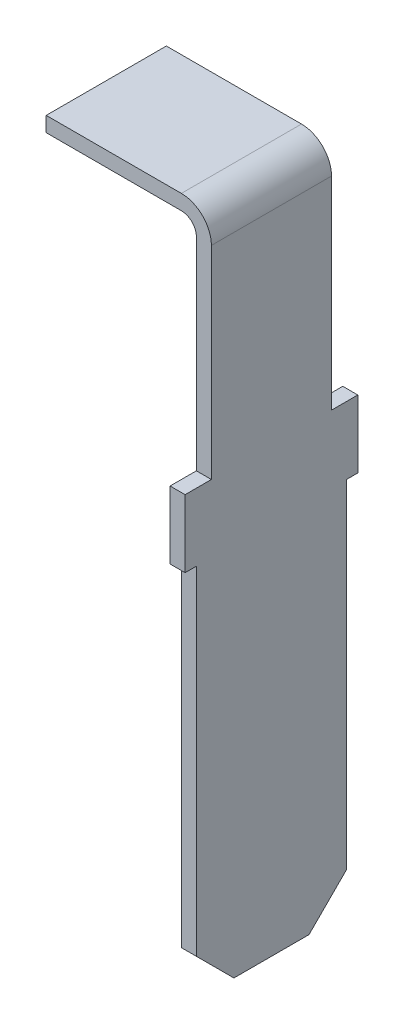
ISO-10303-21;
HEADER;
FILE_DESCRIPTION(('STEP AP214'),'2;1');
FILE_NAME('part.step','',(''),(''),'','','');
FILE_SCHEMA(('AUTOMOTIVE_DESIGN { 1 0 10303 214 1 1 1 1 }'));
ENDSEC;
DATA;
#1=APPLICATION_CONTEXT('core data for automotive mechanical design processes');
#2=APPLICATION_PROTOCOL_DEFINITION('international standard','automotive_design',2000,#1);
#3=PRODUCT_CONTEXT('',#1,'mechanical');
#4=PRODUCT('Part','Part','',(#3));
#5=PRODUCT_RELATED_PRODUCT_CATEGORY('part','',(#4));
#6=PRODUCT_DEFINITION_FORMATION('','',#4);
#7=PRODUCT_DEFINITION_CONTEXT('part definition',#1,'design');
#8=PRODUCT_DEFINITION('design','',#6,#7);
#9=PRODUCT_DEFINITION_SHAPE('','',#8);
#10=(LENGTH_UNIT() NAMED_UNIT(*) SI_UNIT(.MILLI.,.METRE.));
#11=(NAMED_UNIT(*) PLANE_ANGLE_UNIT() SI_UNIT($,.RADIAN.));
#12=(NAMED_UNIT(*) SI_UNIT($,.STERADIAN.) SOLID_ANGLE_UNIT());
#13=UNCERTAINTY_MEASURE_WITH_UNIT(LENGTH_MEASURE(1.E-05),#10,'distance_accuracy_value','');
#14=(GEOMETRIC_REPRESENTATION_CONTEXT(3) GLOBAL_UNCERTAINTY_ASSIGNED_CONTEXT((#13)) GLOBAL_UNIT_ASSIGNED_CONTEXT((#10,
#11,#12)) REPRESENTATION_CONTEXT('',''));
#15=CARTESIAN_POINT('',(0.,0.,0.));
#16=DIRECTION('',(0.,0.,1.));
#17=DIRECTION('',(1.,0.,0.));
#18=AXIS2_PLACEMENT_3D('',#15,#16,#17);
#19=CARTESIAN_POINT('',(67.94,-5.6,5.));
#20=DIRECTION('',(-1.,0.,0.));
#21=DIRECTION('',(0.,0.,1.));
#22=AXIS2_PLACEMENT_3D('',#19,#20,#21);
#23=PLANE('',#22);
#24=DIRECTION('',(0.,1.,0.));
#25=VECTOR('',#24,1.);
#26=CARTESIAN_POINT('',(67.94,-5.6,-0.8));
#27=LINE('',#26,#25);
#28=CARTESIAN_POINT('',(67.94,-5.5,-0.8));
#29=VERTEX_POINT('',#28);
#30=CARTESIAN_POINT('',(67.94,-5.7,-0.8));
#31=VERTEX_POINT('',#30);
#32=EDGE_CURVE('E68',#29,#31,#27,.F.);
#33=ORIENTED_EDGE('',*,*,#32,.T.);
#34=DIRECTION('',(0.,0.,-1.));
#35=VECTOR('',#34,1.);
#36=CARTESIAN_POINT('',(67.94,-5.7,5.));
#37=LINE('',#36,#35);
#38=CARTESIAN_POINT('',(67.94,-5.7,0.8));
#39=VERTEX_POINT('',#38);
#40=EDGE_CURVE('E227',#39,#31,#37,.T.);
#41=ORIENTED_EDGE('',*,*,#40,.F.);
#42=DIRECTION('',(0.,1.,0.));
#43=VECTOR('',#42,1.);
#44=CARTESIAN_POINT('',(67.94,-5.6,0.8));
#45=LINE('',#44,#43);
#46=CARTESIAN_POINT('',(67.94,-5.50000000003333,0.8));
#47=VERTEX_POINT('',#46);
#48=EDGE_CURVE('E292',#39,#47,#45,.T.);
#49=ORIENTED_EDGE('',*,*,#48,.T.);
#50=DIRECTION('',(0.,0.,1.));
#51=VECTOR('',#50,1.);
#52=CARTESIAN_POINT('',(67.94,-5.5,5.));
#53=LINE('',#52,#51);
#54=EDGE_CURVE('E230',#29,#47,#53,.T.);
#55=ORIENTED_EDGE('',*,*,#54,.F.);
#56=EDGE_LOOP('',(#33,#41,#49,#55));
#57=FACE_BOUND('',#56,.T.);
#58=ADVANCED_FACE('F16',(#57),#23,.T.);
#59=CARTESIAN_POINT('',(69.7399999999,-5.9000000001,5.));
#60=DIRECTION('',(0.,0.,-1.));
#61=DIRECTION('',(-1.,0.,0.));
#62=AXIS2_PLACEMENT_3D('',#59,#60,#61);
#63=CYLINDRICAL_SURFACE('',#62,0.199999999999998);
#64=DIRECTION('',(0.,0.,-1.));
#65=VECTOR('',#64,1.);
#66=CARTESIAN_POINT('',(69.74,-5.7,5.));
#67=LINE('',#66,#65);
#68=CARTESIAN_POINT('',(69.73999999995,-5.7,-0.8));
#69=VERTEX_POINT('',#68);
#70=CARTESIAN_POINT('',(69.73999999995,-5.7,0.8));
#71=VERTEX_POINT('',#70);
#72=EDGE_CURVE('E223',#69,#71,#67,.F.);
#73=ORIENTED_EDGE('',*,*,#72,.F.);
#74=CARTESIAN_POINT('',(69.7399999999,-5.9000000001,-0.8));
#75=DIRECTION('',(0.,0.,-1.));
#76=DIRECTION('',(-1.,0.,0.));
#77=AXIS2_PLACEMENT_3D('',#74,#75,#76);
#78=CIRCLE('',#77,0.199999999999998);
#79=CARTESIAN_POINT('',(69.94,-5.90000000005009,-0.8));
#80=VERTEX_POINT('',#79);
#81=EDGE_CURVE('E19',#80,#69,#78,.F.);
#82=ORIENTED_EDGE('',*,*,#81,.F.);
#83=DIRECTION('',(0.,0.,1.));
#84=VECTOR('',#83,1.);
#85=CARTESIAN_POINT('',(69.94,-5.90000000000017,5.));
#86=LINE('',#85,#84);
#87=CARTESIAN_POINT('',(69.93999999995,-5.90000000005009,0.8));
#88=VERTEX_POINT('',#87);
#89=EDGE_CURVE('E179',#88,#80,#86,.F.);
#90=ORIENTED_EDGE('',*,*,#89,.F.);
#91=CARTESIAN_POINT('',(69.7399999999,-5.9000000001,0.8));
#92=DIRECTION('',(0.,0.,-1.));
#93=DIRECTION('',(-1.,0.,0.));
#94=AXIS2_PLACEMENT_3D('',#91,#92,#93);
#95=CIRCLE('',#94,0.199999999999998);
#96=EDGE_CURVE('E235',#71,#88,#95,.T.);
#97=ORIENTED_EDGE('',*,*,#96,.F.);
#98=EDGE_LOOP('',(#73,#82,#90,#97));
#99=FACE_BOUND('',#98,.T.);
#100=ADVANCED_FACE('F313',(#99),#63,.F.);
#101=CARTESIAN_POINT('',(68.8399999999999,-5.5,5.));
#102=DIRECTION('',(0.,1.,0.));
#103=DIRECTION('',(0.,0.,1.));
#104=AXIS2_PLACEMENT_3D('',#101,#102,#103);
#105=PLANE('',#104);
#106=DIRECTION('',(-1.,0.,0.));
#107=VECTOR('',#106,1.);
#108=CARTESIAN_POINT('',(70.14,-5.5,-0.8));
#109=LINE('',#108,#107);
#110=CARTESIAN_POINT('',(69.7399999999499,-5.5,-0.8));
#111=VERTEX_POINT('',#110);
#112=EDGE_CURVE('E174',#29,#111,#109,.F.);
#113=ORIENTED_EDGE('',*,*,#112,.F.);
#114=ORIENTED_EDGE('',*,*,#54,.T.);
#115=DIRECTION('',(1.,0.,0.));
#116=VECTOR('',#115,1.);
#117=CARTESIAN_POINT('',(70.14,-5.5000000001,0.8));
#118=LINE('',#117,#116);
#119=CARTESIAN_POINT('',(69.7399999999499,-5.50000000005,0.8));
#120=VERTEX_POINT('',#119);
#121=EDGE_CURVE('E320',#120,#47,#118,.F.);
#122=ORIENTED_EDGE('',*,*,#121,.F.);
#123=DIRECTION('',(0.,0.,1.));
#124=VECTOR('',#123,1.);
#125=CARTESIAN_POINT('',(69.7399999999998,-5.5,5.));
#126=LINE('',#125,#124);
#127=EDGE_CURVE('E89',#120,#111,#126,.F.);
#128=ORIENTED_EDGE('',*,*,#127,.T.);
#129=EDGE_LOOP('',(#113,#114,#122,#128));
#130=FACE_BOUND('',#129,.T.);
#131=ADVANCED_FACE('F487',(#130),#105,.T.);
#132=CARTESIAN_POINT('',(68.84,-5.7,5.));
#133=DIRECTION('',(0.,-1.,0.));
#134=DIRECTION('',(0.,0.,-1.));
#135=AXIS2_PLACEMENT_3D('',#132,#133,#134);
#136=PLANE('',#135);
#137=DIRECTION('',(-1.,0.,0.));
#138=VECTOR('',#137,1.);
#139=CARTESIAN_POINT('',(70.14,-5.7,-0.8));
#140=LINE('',#139,#138);
#141=EDGE_CURVE('E181',#69,#31,#140,.T.);
#142=ORIENTED_EDGE('',*,*,#141,.F.);
#143=ORIENTED_EDGE('',*,*,#72,.T.);
#144=DIRECTION('',(1.,0.,0.));
#145=VECTOR('',#144,1.);
#146=CARTESIAN_POINT('',(70.14,-5.7,0.8));
#147=LINE('',#146,#145);
#148=EDGE_CURVE('E312',#39,#71,#147,.T.);
#149=ORIENTED_EDGE('',*,*,#148,.F.);
#150=ORIENTED_EDGE('',*,*,#40,.T.);
#151=EDGE_LOOP('',(#142,#143,#149,#150));
#152=FACE_BOUND('',#151,.T.);
#153=ADVANCED_FACE('F490',(#152),#136,.T.);
#154=CARTESIAN_POINT('',(69.94,-10.2000000000001,5.));
#155=DIRECTION('',(-1.,0.,0.));
#156=DIRECTION('',(0.,0.,1.));
#157=AXIS2_PLACEMENT_3D('',#154,#155,#156);
#158=PLANE('',#157);
#159=DIRECTION('',(0.,1.,0.));
#160=VECTOR('',#159,1.);
#161=CARTESIAN_POINT('',(69.94,-9.05,1.15));
#162=LINE('',#161,#160);
#163=CARTESIAN_POINT('',(69.94,-8.6,1.15));
#164=VERTEX_POINT('',#163);
#165=CARTESIAN_POINT('',(69.94,-9.5,1.15));
#166=VERTEX_POINT('',#165);
#167=EDGE_CURVE('E241',#164,#166,#162,.F.);
#168=ORIENTED_EDGE('',*,*,#167,.F.);
#169=DIRECTION('',(0.,0.,1.));
#170=VECTOR('',#169,1.);
#171=CARTESIAN_POINT('',(69.94,-8.6,0.975));
#172=LINE('',#171,#170);
#173=CARTESIAN_POINT('',(69.9399999999333,-8.6,0.8));
#174=VERTEX_POINT('',#173);
#175=EDGE_CURVE('E214',#174,#164,#172,.T.);
#176=ORIENTED_EDGE('',*,*,#175,.F.);
#177=DIRECTION('',(0.,1.,0.));
#178=VECTOR('',#177,1.);
#179=CARTESIAN_POINT('',(69.9399999999,-5.6,0.8));
#180=LINE('',#179,#178);
#181=EDGE_CURVE('E96',#88,#174,#180,.F.);
#182=ORIENTED_EDGE('',*,*,#181,.F.);
#183=ORIENTED_EDGE('',*,*,#89,.T.);
#184=DIRECTION('',(0.,1.,0.));
#185=VECTOR('',#184,1.);
#186=CARTESIAN_POINT('',(69.94,-5.6,-0.8));
#187=LINE('',#186,#185);
#188=CARTESIAN_POINT('',(69.94,-8.6,-0.8));
#189=VERTEX_POINT('',#188);
#190=EDGE_CURVE('E176',#189,#80,#187,.T.);
#191=ORIENTED_EDGE('',*,*,#190,.F.);
#192=DIRECTION('',(0.,0.,1.));
#193=VECTOR('',#192,1.);
#194=CARTESIAN_POINT('',(69.94,-8.6,-0.975));
#195=LINE('',#194,#193);
#196=CARTESIAN_POINT('',(69.94,-8.6,-1.15));
#197=VERTEX_POINT('',#196);
#198=EDGE_CURVE('E164',#197,#189,#195,.T.);
#199=ORIENTED_EDGE('',*,*,#198,.F.);
#200=DIRECTION('',(0.,1.,0.));
#201=VECTOR('',#200,1.);
#202=CARTESIAN_POINT('',(69.94,-9.05,-1.15));
#203=LINE('',#202,#201);
#204=CARTESIAN_POINT('',(69.94,-9.5,-1.15));
#205=VERTEX_POINT('',#204);
#206=EDGE_CURVE('E159',#205,#197,#203,.T.);
#207=ORIENTED_EDGE('',*,*,#206,.F.);
#208=DIRECTION('',(0.,0.,-1.));
#209=VECTOR('',#208,1.);
#210=CARTESIAN_POINT('',(69.94,-9.5,-1.075));
#211=LINE('',#210,#209);
#212=CARTESIAN_POINT('',(69.94,-9.5,-1.));
#213=VERTEX_POINT('',#212);
#214=EDGE_CURVE('E283',#213,#205,#211,.T.);
#215=ORIENTED_EDGE('',*,*,#214,.F.);
#216=DIRECTION('',(0.,1.,0.));
#217=VECTOR('',#216,1.);
#218=CARTESIAN_POINT('',(69.94,-11.75,-1.));
#219=LINE('',#218,#217);
#220=CARTESIAN_POINT('',(69.94,-14.,-1.));
#221=VERTEX_POINT('',#220);
#222=EDGE_CURVE('E277',#221,#213,#219,.T.);
#223=ORIENTED_EDGE('',*,*,#222,.F.);
#224=DIRECTION('',(0.,0.707106781186548,-0.707106781186548));
#225=VECTOR('',#224,1.);
#226=CARTESIAN_POINT('',(69.94,-14.25,-0.75));
#227=LINE('',#226,#225);
#228=CARTESIAN_POINT('',(69.94,-14.5,-0.5));
#229=VERTEX_POINT('',#228);
#230=EDGE_CURVE('E271',#229,#221,#227,.T.);
#231=ORIENTED_EDGE('',*,*,#230,.F.);
#232=DIRECTION('',(0.,0.,-1.));
#233=VECTOR('',#232,1.);
#234=CARTESIAN_POINT('',(69.94,-14.5,0.));
#235=LINE('',#234,#233);
#236=CARTESIAN_POINT('',(69.94,-14.5,0.5));
#237=VERTEX_POINT('',#236);
#238=EDGE_CURVE('E265',#237,#229,#235,.T.);
#239=ORIENTED_EDGE('',*,*,#238,.F.);
#240=DIRECTION('',(0.,-0.707106781186548,-0.707106781186548));
#241=VECTOR('',#240,1.);
#242=CARTESIAN_POINT('',(69.94,-14.25,0.75));
#243=LINE('',#242,#241);
#244=CARTESIAN_POINT('',(69.94,-14.,1.));
#245=VERTEX_POINT('',#244);
#246=EDGE_CURVE('E259',#245,#237,#243,.T.);
#247=ORIENTED_EDGE('',*,*,#246,.F.);
#248=DIRECTION('',(0.,1.,0.));
#249=VECTOR('',#248,1.);
#250=CARTESIAN_POINT('',(69.94,-11.75,1.));
#251=LINE('',#250,#249);
#252=CARTESIAN_POINT('',(69.94,-9.5,1.));
#253=VERTEX_POINT('',#252);
#254=EDGE_CURVE('E253',#253,#245,#251,.F.);
#255=ORIENTED_EDGE('',*,*,#254,.F.);
#256=DIRECTION('',(0.,0.,-1.));
#257=VECTOR('',#256,1.);
#258=CARTESIAN_POINT('',(69.94,-9.5,1.075));
#259=LINE('',#258,#257);
#260=EDGE_CURVE('E247',#166,#253,#259,.T.);
#261=ORIENTED_EDGE('',*,*,#260,.F.);
#262=EDGE_LOOP('',(#168,#176,#182,#183,#191,#199,#207,#215,#223,#231,#239,#247,#255,#261));
#263=FACE_BOUND('',#262,.T.);
#264=ADVANCED_FACE('F178',(#263),#158,.T.);
#265=CARTESIAN_POINT('',(70.14,-5.6,-0.8));
#266=DIRECTION('',(0.,0.,-1.));
#267=DIRECTION('',(-1.,0.,0.));
#268=AXIS2_PLACEMENT_3D('',#265,#266,#267);
#269=PLANE('',#268);
#270=ORIENTED_EDGE('',*,*,#32,.F.);
#271=ORIENTED_EDGE('',*,*,#112,.T.);
#272=CARTESIAN_POINT('',(69.7399999999,-5.9000000001,-0.8));
#273=DIRECTION('',(0.,0.,-1.));
#274=DIRECTION('',(-1.,0.,0.));
#275=AXIS2_PLACEMENT_3D('',#272,#273,#274);
#276=CIRCLE('',#275,0.400000000000002);
#277=CARTESIAN_POINT('',(70.14,-5.90000000005,-0.8));
#278=VERTEX_POINT('',#277);
#279=EDGE_CURVE('E201',#278,#111,#276,.F.);
#280=ORIENTED_EDGE('',*,*,#279,.F.);
#281=DIRECTION('',(0.,1.,0.));
#282=VECTOR('',#281,1.);
#283=CARTESIAN_POINT('',(70.14,-8.51803854646187,-0.8));
#284=LINE('',#283,#282);
#285=CARTESIAN_POINT('',(70.14,-8.6,-0.8));
#286=VERTEX_POINT('',#285);
#287=EDGE_CURVE('E186',#278,#286,#284,.F.);
#288=ORIENTED_EDGE('',*,*,#287,.T.);
#289=DIRECTION('',(1.,0.,0.));
#290=VECTOR('',#289,1.);
#291=CARTESIAN_POINT('',(70.14,-8.6,-0.8));
#292=LINE('',#291,#290);
#293=EDGE_CURVE('E169',#189,#286,#292,.T.);
#294=ORIENTED_EDGE('',*,*,#293,.F.);
#295=ORIENTED_EDGE('',*,*,#190,.T.);
#296=ORIENTED_EDGE('',*,*,#81,.T.);
#297=ORIENTED_EDGE('',*,*,#141,.T.);
#298=EDGE_LOOP('',(#270,#271,#280,#288,#294,#295,#296,#297));
#299=FACE_BOUND('',#298,.T.);
#300=ADVANCED_FACE('F184',(#299),#269,.T.);
#301=CARTESIAN_POINT('',(70.14,-8.6,-0.975));
#302=DIRECTION('',(0.,1.,0.));
#303=DIRECTION('',(0.,0.,1.));
#304=AXIS2_PLACEMENT_3D('',#301,#302,#303);
#305=PLANE('',#304);
#306=DIRECTION('',(0.,0.,1.));
#307=VECTOR('',#306,1.);
#308=CARTESIAN_POINT('',(70.14,-8.6,0.));
#309=LINE('',#308,#307);
#310=CARTESIAN_POINT('',(70.14,-8.6,-1.15));
#311=VERTEX_POINT('',#310);
#312=EDGE_CURVE('E200',#286,#311,#309,.F.);
#313=ORIENTED_EDGE('',*,*,#312,.T.);
#314=DIRECTION('',(-1.,0.,0.));
#315=VECTOR('',#314,1.);
#316=CARTESIAN_POINT('',(70.14,-8.6,-1.15));
#317=LINE('',#316,#315);
#318=EDGE_CURVE('E171',#197,#311,#317,.F.);
#319=ORIENTED_EDGE('',*,*,#318,.F.);
#320=ORIENTED_EDGE('',*,*,#198,.T.);
#321=ORIENTED_EDGE('',*,*,#293,.T.);
#322=EDGE_LOOP('',(#313,#319,#320,#321));
#323=FACE_BOUND('',#322,.T.);
#324=ADVANCED_FACE('F167',(#323),#305,.T.);
#325=CARTESIAN_POINT('',(70.14,-9.05,-1.15));
#326=DIRECTION('',(0.,0.,-1.));
#327=DIRECTION('',(-1.,0.,0.));
#328=AXIS2_PLACEMENT_3D('',#325,#326,#327);
#329=PLANE('',#328);
#330=DIRECTION('',(0.,1.,0.));
#331=VECTOR('',#330,1.);
#332=CARTESIAN_POINT('',(70.14,-8.51803854646187,-1.15));
#333=LINE('',#332,#331);
#334=CARTESIAN_POINT('',(70.14,-9.5,-1.15));
#335=VERTEX_POINT('',#334);
#336=EDGE_CURVE('E424',#311,#335,#333,.F.);
#337=ORIENTED_EDGE('',*,*,#336,.T.);
#338=DIRECTION('',(1.,0.,0.));
#339=VECTOR('',#338,1.);
#340=CARTESIAN_POINT('',(70.14,-9.5,-1.15));
#341=LINE('',#340,#339);
#342=EDGE_CURVE('E280',#205,#335,#341,.T.);
#343=ORIENTED_EDGE('',*,*,#342,.F.);
#344=ORIENTED_EDGE('',*,*,#206,.T.);
#345=ORIENTED_EDGE('',*,*,#318,.T.);
#346=EDGE_LOOP('',(#337,#343,#344,#345));
#347=FACE_BOUND('',#346,.T.);
#348=ADVANCED_FACE('F446',(#347),#329,.T.);
#349=CARTESIAN_POINT('',(70.14,-9.5,-1.075));
#350=DIRECTION('',(0.,-1.,0.));
#351=DIRECTION('',(0.,0.,-1.));
#352=AXIS2_PLACEMENT_3D('',#349,#350,#351);
#353=PLANE('',#352);
#354=DIRECTION('',(0.,0.,1.));
#355=VECTOR('',#354,1.);
#356=CARTESIAN_POINT('',(70.14,-9.5,0.));
#357=LINE('',#356,#355);
#358=CARTESIAN_POINT('',(70.14,-9.5,-1.));
#359=VERTEX_POINT('',#358);
#360=EDGE_CURVE('E414',#335,#359,#357,.T.);
#361=ORIENTED_EDGE('',*,*,#360,.T.);
#362=DIRECTION('',(-1.,0.,0.));
#363=VECTOR('',#362,1.);
#364=CARTESIAN_POINT('',(70.14,-9.5,-1.));
#365=LINE('',#364,#363);
#366=EDGE_CURVE('E274',#213,#359,#365,.F.);
#367=ORIENTED_EDGE('',*,*,#366,.F.);
#368=ORIENTED_EDGE('',*,*,#214,.T.);
#369=ORIENTED_EDGE('',*,*,#342,.T.);
#370=EDGE_LOOP('',(#361,#367,#368,#369));
#371=FACE_BOUND('',#370,.T.);
#372=ADVANCED_FACE('F448',(#371),#353,.T.);
#373=CARTESIAN_POINT('',(70.14,-11.75,-1.));
#374=DIRECTION('',(0.,0.,-1.));
#375=DIRECTION('',(-1.,0.,0.));
#376=AXIS2_PLACEMENT_3D('',#373,#374,#375);
#377=PLANE('',#376);
#378=DIRECTION('',(0.,1.,0.));
#379=VECTOR('',#378,1.);
#380=CARTESIAN_POINT('',(70.14,-8.51803854646187,-1.));
#381=LINE('',#380,#379);
#382=CARTESIAN_POINT('',(70.14,-14.,-1.));
#383=VERTEX_POINT('',#382);
#384=EDGE_CURVE('E404',#359,#383,#381,.F.);
#385=ORIENTED_EDGE('',*,*,#384,.T.);
#386=DIRECTION('',(1.,0.,0.));
#387=VECTOR('',#386,1.);
#388=CARTESIAN_POINT('',(70.14,-14.,-1.));
#389=LINE('',#388,#387);
#390=EDGE_CURVE('E268',#221,#383,#389,.T.);
#391=ORIENTED_EDGE('',*,*,#390,.F.);
#392=ORIENTED_EDGE('',*,*,#222,.T.);
#393=ORIENTED_EDGE('',*,*,#366,.T.);
#394=EDGE_LOOP('',(#385,#391,#392,#393));
#395=FACE_BOUND('',#394,.T.);
#396=ADVANCED_FACE('F457',(#395),#377,.T.);
#397=CARTESIAN_POINT('',(70.14,-14.25,-0.75));
#398=DIRECTION('',(0.,-0.707106781186548,-0.707106781186548));
#399=DIRECTION('',(0.,0.707106781186548,-0.707106781186548));
#400=AXIS2_PLACEMENT_3D('',#397,#398,#399);
#401=PLANE('',#400);
#402=DIRECTION('',(0.,-0.707106781186548,0.707106781186547));
#403=VECTOR('',#402,1.);
#404=CARTESIAN_POINT('',(70.14,-14.,-1.));
#405=LINE('',#404,#403);
#406=CARTESIAN_POINT('',(70.14,-14.5,-0.5));
#407=VERTEX_POINT('',#406);
#408=EDGE_CURVE('E394',#383,#407,#405,.T.);
#409=ORIENTED_EDGE('',*,*,#408,.T.);
#410=DIRECTION('',(1.,0.,0.));
#411=VECTOR('',#410,1.);
#412=CARTESIAN_POINT('',(70.14,-14.5,-0.5));
#413=LINE('',#412,#411);
#414=EDGE_CURVE('E262',#229,#407,#413,.T.);
#415=ORIENTED_EDGE('',*,*,#414,.F.);
#416=ORIENTED_EDGE('',*,*,#230,.T.);
#417=ORIENTED_EDGE('',*,*,#390,.T.);
#418=EDGE_LOOP('',(#409,#415,#416,#417));
#419=FACE_BOUND('',#418,.T.);
#420=ADVANCED_FACE('F460',(#419),#401,.T.);
#421=CARTESIAN_POINT('',(70.14,-14.5,0.));
#422=DIRECTION('',(0.,-1.,0.));
#423=DIRECTION('',(0.,0.,-1.));
#424=AXIS2_PLACEMENT_3D('',#421,#422,#423);
#425=PLANE('',#424);
#426=DIRECTION('',(0.,0.,1.));
#427=VECTOR('',#426,1.);
#428=CARTESIAN_POINT('',(70.14,-14.5,0.));
#429=LINE('',#428,#427);
#430=CARTESIAN_POINT('',(70.14,-14.5,0.5));
#431=VERTEX_POINT('',#430);
#432=EDGE_CURVE('E384',#407,#431,#429,.T.);
#433=ORIENTED_EDGE('',*,*,#432,.T.);
#434=DIRECTION('',(1.,0.,0.));
#435=VECTOR('',#434,1.);
#436=CARTESIAN_POINT('',(70.14,-14.5,0.5));
#437=LINE('',#436,#435);
#438=EDGE_CURVE('E256',#237,#431,#437,.T.);
#439=ORIENTED_EDGE('',*,*,#438,.F.);
#440=ORIENTED_EDGE('',*,*,#238,.T.);
#441=ORIENTED_EDGE('',*,*,#414,.T.);
#442=EDGE_LOOP('',(#433,#439,#440,#441));
#443=FACE_BOUND('',#442,.T.);
#444=ADVANCED_FACE('F466',(#443),#425,.T.);
#445=CARTESIAN_POINT('',(70.14,-14.25,0.75));
#446=DIRECTION('',(0.,-0.707106781186548,0.707106781186548));
#447=DIRECTION('',(0.,-0.707106781186548,-0.707106781186548));
#448=AXIS2_PLACEMENT_3D('',#445,#446,#447);
#449=PLANE('',#448);
#450=DIRECTION('',(0.,0.707106781186548,0.707106781186547));
#451=VECTOR('',#450,1.);
#452=CARTESIAN_POINT('',(70.14,-14.5,0.5));
#453=LINE('',#452,#451);
#454=CARTESIAN_POINT('',(70.14,-14.,1.));
#455=VERTEX_POINT('',#454);
#456=EDGE_CURVE('E374',#431,#455,#453,.T.);
#457=ORIENTED_EDGE('',*,*,#456,.T.);
#458=DIRECTION('',(1.,0.,0.));
#459=VECTOR('',#458,1.);
#460=CARTESIAN_POINT('',(70.14,-14.,1.));
#461=LINE('',#460,#459);
#462=EDGE_CURVE('E250',#245,#455,#461,.T.);
#463=ORIENTED_EDGE('',*,*,#462,.F.);
#464=ORIENTED_EDGE('',*,*,#246,.T.);
#465=ORIENTED_EDGE('',*,*,#438,.T.);
#466=EDGE_LOOP('',(#457,#463,#464,#465));
#467=FACE_BOUND('',#466,.T.);
#468=ADVANCED_FACE('F473',(#467),#449,.T.);
#469=CARTESIAN_POINT('',(70.14,-11.75,1.));
#470=DIRECTION('',(0.,0.,1.));
#471=DIRECTION('',(1.,0.,0.));
#472=AXIS2_PLACEMENT_3D('',#469,#470,#471);
#473=PLANE('',#472);
#474=DIRECTION('',(0.,1.,0.));
#475=VECTOR('',#474,1.);
#476=CARTESIAN_POINT('',(70.14,-8.51803854646187,1.));
#477=LINE('',#476,#475);
#478=CARTESIAN_POINT('',(70.14,-9.5,1.));
#479=VERTEX_POINT('',#478);
#480=EDGE_CURVE('E364',#455,#479,#477,.T.);
#481=ORIENTED_EDGE('',*,*,#480,.T.);
#482=DIRECTION('',(1.,0.,0.));
#483=VECTOR('',#482,1.);
#484=CARTESIAN_POINT('',(70.14,-9.5,1.));
#485=LINE('',#484,#483);
#486=EDGE_CURVE('E244',#253,#479,#485,.T.);
#487=ORIENTED_EDGE('',*,*,#486,.F.);
#488=ORIENTED_EDGE('',*,*,#254,.T.);
#489=ORIENTED_EDGE('',*,*,#462,.T.);
#490=EDGE_LOOP('',(#481,#487,#488,#489));
#491=FACE_BOUND('',#490,.T.);
#492=ADVANCED_FACE('F475',(#491),#473,.T.);
#493=CARTESIAN_POINT('',(70.14,-9.5,1.075));
#494=DIRECTION('',(0.,-1.,0.));
#495=DIRECTION('',(0.,0.,-1.));
#496=AXIS2_PLACEMENT_3D('',#493,#494,#495);
#497=PLANE('',#496);
#498=DIRECTION('',(0.,0.,1.));
#499=VECTOR('',#498,1.);
#500=CARTESIAN_POINT('',(70.14,-9.5,0.));
#501=LINE('',#500,#499);
#502=CARTESIAN_POINT('',(70.14,-9.5,1.15));
#503=VERTEX_POINT('',#502);
#504=EDGE_CURVE('E354',#479,#503,#501,.T.);
#505=ORIENTED_EDGE('',*,*,#504,.T.);
#506=DIRECTION('',(1.,0.,0.));
#507=VECTOR('',#506,1.);
#508=CARTESIAN_POINT('',(70.14,-9.5,1.15));
#509=LINE('',#508,#507);
#510=EDGE_CURVE('E218',#166,#503,#509,.T.);
#511=ORIENTED_EDGE('',*,*,#510,.F.);
#512=ORIENTED_EDGE('',*,*,#260,.T.);
#513=ORIENTED_EDGE('',*,*,#486,.T.);
#514=EDGE_LOOP('',(#505,#511,#512,#513));
#515=FACE_BOUND('',#514,.T.);
#516=ADVANCED_FACE('F481',(#515),#497,.T.);
#517=CARTESIAN_POINT('',(70.14,-9.05,1.15));
#518=DIRECTION('',(0.,0.,1.));
#519=DIRECTION('',(1.,0.,0.));
#520=AXIS2_PLACEMENT_3D('',#517,#518,#519);
#521=PLANE('',#520);
#522=DIRECTION('',(0.,1.,0.));
#523=VECTOR('',#522,1.);
#524=CARTESIAN_POINT('',(70.14,-8.51803854646187,1.15));
#525=LINE('',#524,#523);
#526=CARTESIAN_POINT('',(70.14,-8.6,1.15));
#527=VERTEX_POINT('',#526);
#528=EDGE_CURVE('E343',#503,#527,#525,.T.);
#529=ORIENTED_EDGE('',*,*,#528,.T.);
#530=DIRECTION('',(1.,0.,0.));
#531=VECTOR('',#530,1.);
#532=CARTESIAN_POINT('',(70.14,-8.6,1.15));
#533=LINE('',#532,#531);
#534=EDGE_CURVE('E217',#164,#527,#533,.T.);
#535=ORIENTED_EDGE('',*,*,#534,.F.);
#536=ORIENTED_EDGE('',*,*,#167,.T.);
#537=ORIENTED_EDGE('',*,*,#510,.T.);
#538=EDGE_LOOP('',(#529,#535,#536,#537));
#539=FACE_BOUND('',#538,.T.);
#540=ADVANCED_FACE('F484',(#539),#521,.T.);
#541=CARTESIAN_POINT('',(70.14,-8.6,0.975));
#542=DIRECTION('',(0.,1.,0.));
#543=DIRECTION('',(0.,0.,1.));
#544=AXIS2_PLACEMENT_3D('',#541,#542,#543);
#545=PLANE('',#544);
#546=DIRECTION('',(0.,0.,1.));
#547=VECTOR('',#546,1.);
#548=CARTESIAN_POINT('',(70.14,-8.6,0.));
#549=LINE('',#548,#547);
#550=CARTESIAN_POINT('',(70.14,-8.6,0.8));
#551=VERTEX_POINT('',#550);
#552=EDGE_CURVE('E335',#527,#551,#549,.F.);
#553=ORIENTED_EDGE('',*,*,#552,.T.);
#554=DIRECTION('',(1.,0.,0.));
#555=VECTOR('',#554,1.);
#556=CARTESIAN_POINT('',(70.14,-8.6,0.8));
#557=LINE('',#556,#555);
#558=EDGE_CURVE('E304',#174,#551,#557,.T.);
#559=ORIENTED_EDGE('',*,*,#558,.F.);
#560=ORIENTED_EDGE('',*,*,#175,.T.);
#561=ORIENTED_EDGE('',*,*,#534,.T.);
#562=EDGE_LOOP('',(#553,#559,#560,#561));
#563=FACE_BOUND('',#562,.T.);
#564=ADVANCED_FACE('F486',(#563),#545,.T.);
#565=CARTESIAN_POINT('',(70.14,-5.6,0.8));
#566=DIRECTION('',(0.,0.,1.));
#567=DIRECTION('',(1.,0.,0.));
#568=AXIS2_PLACEMENT_3D('',#565,#566,#567);
#569=PLANE('',#568);
#570=ORIENTED_EDGE('',*,*,#558,.T.);
#571=DIRECTION('',(0.,1.,0.));
#572=VECTOR('',#571,1.);
#573=CARTESIAN_POINT('',(70.14,-8.51803854646187,0.8));
#574=LINE('',#573,#572);
#575=CARTESIAN_POINT('',(70.14,-5.90000000005,0.8));
#576=VERTEX_POINT('',#575);
#577=EDGE_CURVE('E26',#551,#576,#574,.T.);
#578=ORIENTED_EDGE('',*,*,#577,.T.);
#579=CARTESIAN_POINT('',(69.7399999999,-5.9000000001,0.8));
#580=DIRECTION('',(0.,0.,-1.));
#581=DIRECTION('',(-1.,0.,0.));
#582=AXIS2_PLACEMENT_3D('',#579,#580,#581);
#583=CIRCLE('',#582,0.400000000000002);
#584=EDGE_CURVE('E34',#120,#576,#583,.T.);
#585=ORIENTED_EDGE('',*,*,#584,.F.);
#586=ORIENTED_EDGE('',*,*,#121,.T.);
#587=ORIENTED_EDGE('',*,*,#48,.F.);
#588=ORIENTED_EDGE('',*,*,#148,.T.);
#589=ORIENTED_EDGE('',*,*,#96,.T.);
#590=ORIENTED_EDGE('',*,*,#181,.T.);
#591=EDGE_LOOP('',(#570,#578,#585,#586,#587,#588,#589,#590));
#592=FACE_BOUND('',#591,.T.);
#593=ADVANCED_FACE('F310',(#592),#569,.T.);
#594=CARTESIAN_POINT('',(69.7399999999,-5.9000000001,5.));
#595=DIRECTION('',(0.,0.,-1.));
#596=DIRECTION('',(-1.,0.,0.));
#597=AXIS2_PLACEMENT_3D('',#594,#595,#596);
#598=CYLINDRICAL_SURFACE('',#597,0.400000000000002);
#599=ORIENTED_EDGE('',*,*,#279,.T.);
#600=ORIENTED_EDGE('',*,*,#127,.F.);
#601=ORIENTED_EDGE('',*,*,#584,.T.);
#602=DIRECTION('',(0.,0.,1.));
#603=VECTOR('',#602,1.);
#604=CARTESIAN_POINT('',(70.14,-5.9,0.));
#605=LINE('',#604,#603);
#606=EDGE_CURVE('E10',#576,#278,#605,.F.);
#607=ORIENTED_EDGE('',*,*,#606,.T.);
#608=EDGE_LOOP('',(#599,#600,#601,#607));
#609=FACE_BOUND('',#608,.T.);
#610=ADVANCED_FACE('F491',(#609),#598,.T.);
#611=CARTESIAN_POINT('',(70.14,-8.51803854646187,0.));
#612=DIRECTION('',(-1.,0.,0.));
#613=DIRECTION('',(0.,0.,1.));
#614=AXIS2_PLACEMENT_3D('',#611,#612,#613);
#615=PLANE('',#614);
#616=ORIENTED_EDGE('',*,*,#577,.F.);
#617=ORIENTED_EDGE('',*,*,#552,.F.);
#618=ORIENTED_EDGE('',*,*,#528,.F.);
#619=ORIENTED_EDGE('',*,*,#504,.F.);
#620=ORIENTED_EDGE('',*,*,#480,.F.);
#621=ORIENTED_EDGE('',*,*,#456,.F.);
#622=ORIENTED_EDGE('',*,*,#432,.F.);
#623=ORIENTED_EDGE('',*,*,#408,.F.);
#624=ORIENTED_EDGE('',*,*,#384,.F.);
#625=ORIENTED_EDGE('',*,*,#360,.F.);
#626=ORIENTED_EDGE('',*,*,#336,.F.);
#627=ORIENTED_EDGE('',*,*,#312,.F.);
#628=ORIENTED_EDGE('',*,*,#287,.F.);
#629=ORIENTED_EDGE('',*,*,#606,.F.);
#630=EDGE_LOOP('',(#616,#617,#618,#619,#620,#621,#622,#623,#624,#625,#626,#627,#628,#629));
#631=FACE_BOUND('',#630,.T.);
#632=ADVANCED_FACE('F443',(#631),#615,.F.);
#633=CLOSED_SHELL('',(#58,#100,#131,#153,#264,#300,#324,#348,#372,#396,#420,#444,#468,#492,#516,
#540,#564,#593,#610,#632));
#634=MANIFOLD_SOLID_BREP('B1',#633);
#635=ADVANCED_BREP_SHAPE_REPRESENTATION('',(#18,#634),#14);
#636=SHAPE_DEFINITION_REPRESENTATION(#9,#635);
ENDSEC;
END-ISO-10303-21;
